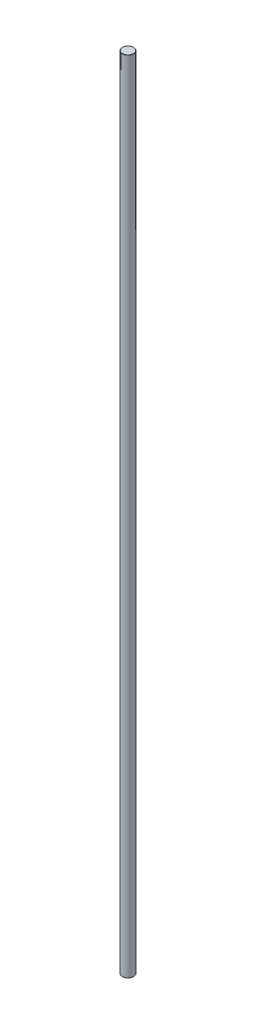
ISO-10303-21;
HEADER;
FILE_DESCRIPTION(('STEP AP214'),'2;1');
FILE_NAME('part.step','',(''),(''),'','','');
FILE_SCHEMA(('AUTOMOTIVE_DESIGN { 1 0 10303 214 1 1 1 1 }'));
ENDSEC;
DATA;
#1=APPLICATION_CONTEXT('core data for automotive mechanical design processes');
#2=APPLICATION_PROTOCOL_DEFINITION('international standard','automotive_design',2000,#1);
#3=PRODUCT_CONTEXT('',#1,'mechanical');
#4=PRODUCT('Part','Part','',(#3));
#5=PRODUCT_RELATED_PRODUCT_CATEGORY('part','',(#4));
#6=PRODUCT_DEFINITION_FORMATION('','',#4);
#7=PRODUCT_DEFINITION_CONTEXT('part definition',#1,'design');
#8=PRODUCT_DEFINITION('design','',#6,#7);
#9=PRODUCT_DEFINITION_SHAPE('','',#8);
#10=(LENGTH_UNIT() NAMED_UNIT(*) SI_UNIT(.MILLI.,.METRE.));
#11=(NAMED_UNIT(*) PLANE_ANGLE_UNIT() SI_UNIT($,.RADIAN.));
#12=(NAMED_UNIT(*) SI_UNIT($,.STERADIAN.) SOLID_ANGLE_UNIT());
#13=UNCERTAINTY_MEASURE_WITH_UNIT(LENGTH_MEASURE(1.E-05),#10,'distance_accuracy_value','');
#14=(GEOMETRIC_REPRESENTATION_CONTEXT(3) GLOBAL_UNCERTAINTY_ASSIGNED_CONTEXT((#13)) GLOBAL_UNIT_ASSIGNED_CONTEXT((#10,
#11,#12)) REPRESENTATION_CONTEXT('',''));
#15=CARTESIAN_POINT('',(0.,0.,0.));
#16=DIRECTION('',(0.,0.,1.));
#17=DIRECTION('',(1.,0.,0.));
#18=AXIS2_PLACEMENT_3D('',#15,#16,#17);
#19=CARTESIAN_POINT('',(0.,-1000.,0.));
#20=DIRECTION('',(0.,1.,0.));
#21=DIRECTION('',(0.,0.,1.));
#22=AXIS2_PLACEMENT_3D('',#19,#20,#21);
#23=CYLINDRICAL_SURFACE('',#22,7.);
#24=CARTESIAN_POINT('',(0.,-0.199999999999867,0.));
#25=DIRECTION('',(0.,1.,0.));
#26=DIRECTION('',(0.,0.,1.));
#27=AXIS2_PLACEMENT_3D('',#24,#25,#26);
#28=CIRCLE('',#27,7.);
#29=CARTESIAN_POINT('',(0.,-0.199999999999867,7.));
#30=VERTEX_POINT('',#29);
#31=EDGE_CURVE('E39',#30,#30,#28,.F.);
#32=ORIENTED_EDGE('',*,*,#31,.T.);
#33=EDGE_LOOP('',(#32));
#34=FACE_BOUND('',#33,.T.);
#35=CARTESIAN_POINT('',(0.,-999.8,0.));
#36=DIRECTION('',(0.,1.,0.));
#37=DIRECTION('',(0.,0.,1.));
#38=AXIS2_PLACEMENT_3D('',#35,#36,#37);
#39=CIRCLE('',#38,7.);
#40=CARTESIAN_POINT('',(0.,-999.8,7.));
#41=VERTEX_POINT('',#40);
#42=EDGE_CURVE('E43',#41,#41,#39,.T.);
#43=ORIENTED_EDGE('',*,*,#42,.T.);
#44=EDGE_LOOP('',(#43));
#45=FACE_BOUND('',#44,.T.);
#46=ADVANCED_FACE('F32',(#34,#45),#23,.T.);
#47=CARTESIAN_POINT('',(0.,-1000.,0.));
#48=DIRECTION('',(0.,1.,0.));
#49=DIRECTION('',(0.,0.,1.));
#50=AXIS2_PLACEMENT_3D('',#47,#48,#49);
#51=PLANE('',#50);
#52=CARTESIAN_POINT('',(0.,-1000.,0.));
#53=DIRECTION('',(0.,1.,0.));
#54=DIRECTION('',(0.,0.,1.));
#55=AXIS2_PLACEMENT_3D('',#52,#53,#54);
#56=CIRCLE('',#55,6.80000000000003);
#57=CARTESIAN_POINT('',(0.,-1000.,6.80000000000003));
#58=VERTEX_POINT('',#57);
#59=EDGE_CURVE('E10',#58,#58,#56,.F.);
#60=ORIENTED_EDGE('',*,*,#59,.T.);
#61=EDGE_LOOP('',(#60));
#62=FACE_BOUND('',#61,.T.);
#63=ADVANCED_FACE('F63',(#62),#51,.F.);
#64=CARTESIAN_POINT('',(0.,0.,0.));
#65=DIRECTION('',(0.,1.,0.));
#66=DIRECTION('',(0.,0.,1.));
#67=AXIS2_PLACEMENT_3D('',#64,#65,#66);
#68=PLANE('',#67);
#69=CARTESIAN_POINT('',(0.,0.,0.));
#70=DIRECTION('',(0.,1.,0.));
#71=DIRECTION('',(0.,0.,1.));
#72=AXIS2_PLACEMENT_3D('',#69,#70,#71);
#73=CIRCLE('',#72,6.80000000000014);
#74=CARTESIAN_POINT('',(0.,0.,6.80000000000014));
#75=VERTEX_POINT('',#74);
#76=EDGE_CURVE('E47',#75,#75,#73,.T.);
#77=ORIENTED_EDGE('',*,*,#76,.T.);
#78=EDGE_LOOP('',(#77));
#79=FACE_BOUND('',#78,.T.);
#80=ADVANCED_FACE('F53',(#79),#68,.T.);
#81=CARTESIAN_POINT('',(0.,0.,0.));
#82=DIRECTION('',(0.,-1.,0.));
#83=DIRECTION('',(0.,0.,-1.));
#84=AXIS2_PLACEMENT_3D('',#81,#82,#83);
#85=CONICAL_SURFACE('',#84,6.80000000000014,0.785398163397435);
#86=ORIENTED_EDGE('',*,*,#31,.F.);
#87=EDGE_LOOP('',(#86));
#88=FACE_BOUND('',#87,.T.);
#89=ORIENTED_EDGE('',*,*,#76,.F.);
#90=EDGE_LOOP('',(#89));
#91=FACE_BOUND('',#90,.T.);
#92=ADVANCED_FACE('F55',(#88,#91),#85,.T.);
#93=CARTESIAN_POINT('',(0.,-999.8,0.));
#94=DIRECTION('',(0.,1.,0.));
#95=DIRECTION('',(0.,0.,1.));
#96=AXIS2_PLACEMENT_3D('',#93,#94,#95);
#97=CONICAL_SURFACE('',#96,7.,0.785398163397715);
#98=ORIENTED_EDGE('',*,*,#59,.F.);
#99=EDGE_LOOP('',(#98));
#100=FACE_BOUND('',#99,.T.);
#101=ORIENTED_EDGE('',*,*,#42,.F.);
#102=EDGE_LOOP('',(#101));
#103=FACE_BOUND('',#102,.T.);
#104=ADVANCED_FACE('F34',(#100,#103),#97,.T.);
#105=CLOSED_SHELL('',(#46,#63,#80,#92,#104));
#106=MANIFOLD_SOLID_BREP('B2',#105);
#107=ADVANCED_BREP_SHAPE_REPRESENTATION('',(#18,#106),#14);
#108=SHAPE_DEFINITION_REPRESENTATION(#9,#107);
ENDSEC;
END-ISO-10303-21;
